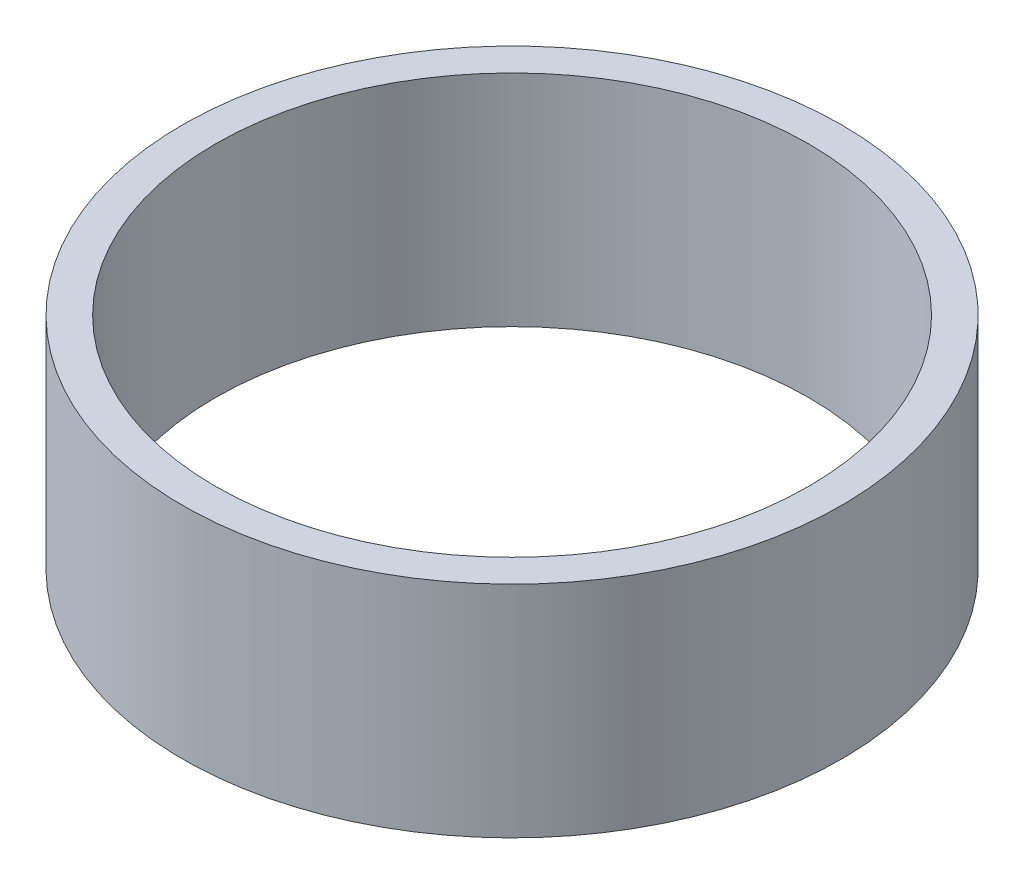
ISO-10303-21;
HEADER;
FILE_DESCRIPTION(('STEP AP214'),'2;1');
FILE_NAME('part.step','',(''),(''),'','','');
FILE_SCHEMA(('AUTOMOTIVE_DESIGN { 1 0 10303 214 1 1 1 1 }'));
ENDSEC;
DATA;
#1=APPLICATION_CONTEXT('core data for automotive mechanical design processes');
#2=APPLICATION_PROTOCOL_DEFINITION('international standard','automotive_design',2000,#1);
#3=PRODUCT_CONTEXT('',#1,'mechanical');
#4=PRODUCT('Part','Part','',(#3));
#5=PRODUCT_RELATED_PRODUCT_CATEGORY('part','',(#4));
#6=PRODUCT_DEFINITION_FORMATION('','',#4);
#7=PRODUCT_DEFINITION_CONTEXT('part definition',#1,'design');
#8=PRODUCT_DEFINITION('design','',#6,#7);
#9=PRODUCT_DEFINITION_SHAPE('','',#8);
#10=(LENGTH_UNIT() NAMED_UNIT(*) SI_UNIT(.MILLI.,.METRE.));
#11=(NAMED_UNIT(*) PLANE_ANGLE_UNIT() SI_UNIT($,.RADIAN.));
#12=(NAMED_UNIT(*) SI_UNIT($,.STERADIAN.) SOLID_ANGLE_UNIT());
#13=UNCERTAINTY_MEASURE_WITH_UNIT(LENGTH_MEASURE(1.E-05),#10,'distance_accuracy_value','');
#14=(GEOMETRIC_REPRESENTATION_CONTEXT(3) GLOBAL_UNCERTAINTY_ASSIGNED_CONTEXT((#13)) GLOBAL_UNIT_ASSIGNED_CONTEXT((#10,
#11,#12)) REPRESENTATION_CONTEXT('',''));
#15=CARTESIAN_POINT('',(0.,0.,0.));
#16=DIRECTION('',(0.,0.,1.));
#17=DIRECTION('',(1.,0.,0.));
#18=AXIS2_PLACEMENT_3D('',#15,#16,#17);
#19=CARTESIAN_POINT('',(0.,25.4,0.));
#20=DIRECTION('',(0.,-1.,0.));
#21=DIRECTION('',(0.,0.,-1.));
#22=AXIS2_PLACEMENT_3D('',#19,#20,#21);
#23=CYLINDRICAL_SURFACE('',#22,68.58);
#24=CARTESIAN_POINT('',(0.,-25.4,0.));
#25=DIRECTION('',(0.,-1.,0.));
#26=DIRECTION('',(0.,0.,-1.));
#27=AXIS2_PLACEMENT_3D('',#24,#25,#26);
#28=CIRCLE('',#27,68.58);
#29=CARTESIAN_POINT('',(0.,-25.4,-68.58));
#30=VERTEX_POINT('',#29);
#31=EDGE_CURVE('E27',#30,#30,#28,.T.);
#32=ORIENTED_EDGE('',*,*,#31,.T.);
#33=EDGE_LOOP('',(#32));
#34=FACE_BOUND('',#33,.T.);
#35=CARTESIAN_POINT('',(0.,25.4,0.));
#36=DIRECTION('',(0.,-1.,0.));
#37=DIRECTION('',(0.,0.,-1.));
#38=AXIS2_PLACEMENT_3D('',#35,#36,#37);
#39=CIRCLE('',#38,68.58);
#40=CARTESIAN_POINT('',(0.,25.4,-68.58));
#41=VERTEX_POINT('',#40);
#42=EDGE_CURVE('E18',#41,#41,#39,.T.);
#43=ORIENTED_EDGE('',*,*,#42,.F.);
#44=EDGE_LOOP('',(#43));
#45=FACE_BOUND('',#44,.T.);
#46=ADVANCED_FACE('F15',(#34,#45),#23,.F.);
#47=CARTESIAN_POINT('',(0.,25.4,0.));
#48=DIRECTION('',(0.,1.,0.));
#49=DIRECTION('',(0.,0.,1.));
#50=AXIS2_PLACEMENT_3D('',#47,#48,#49);
#51=PLANE('',#50);
#52=ORIENTED_EDGE('',*,*,#42,.T.);
#53=EDGE_LOOP('',(#52));
#54=FACE_BOUND('',#53,.T.);
#55=CARTESIAN_POINT('',(0.,25.4,0.));
#56=DIRECTION('',(0.,-1.,0.));
#57=DIRECTION('',(0.,0.,-1.));
#58=AXIS2_PLACEMENT_3D('',#55,#56,#57);
#59=CIRCLE('',#58,76.2);
#60=CARTESIAN_POINT('',(0.,25.4,-76.2));
#61=VERTEX_POINT('',#60);
#62=EDGE_CURVE('E22',#61,#61,#59,.T.);
#63=ORIENTED_EDGE('',*,*,#62,.F.);
#64=EDGE_LOOP('',(#63));
#65=FACE_BOUND('',#64,.T.);
#66=ADVANCED_FACE('F35',(#54,#65),#51,.T.);
#67=CARTESIAN_POINT('',(0.,-25.4,0.));
#68=DIRECTION('',(0.,1.,0.));
#69=DIRECTION('',(0.,0.,1.));
#70=AXIS2_PLACEMENT_3D('',#67,#68,#69);
#71=PLANE('',#70);
#72=ORIENTED_EDGE('',*,*,#31,.F.);
#73=EDGE_LOOP('',(#72));
#74=FACE_BOUND('',#73,.T.);
#75=CARTESIAN_POINT('',(0.,-25.4,0.));
#76=DIRECTION('',(0.,-1.,0.));
#77=DIRECTION('',(0.,0.,-1.));
#78=AXIS2_PLACEMENT_3D('',#75,#76,#77);
#79=CIRCLE('',#78,76.2);
#80=CARTESIAN_POINT('',(0.,-25.4,-76.2));
#81=VERTEX_POINT('',#80);
#82=EDGE_CURVE('E10',#81,#81,#79,.F.);
#83=ORIENTED_EDGE('',*,*,#82,.F.);
#84=EDGE_LOOP('',(#83));
#85=FACE_BOUND('',#84,.T.);
#86=ADVANCED_FACE('F43',(#74,#85),#71,.F.);
#87=CARTESIAN_POINT('',(0.,25.4,0.));
#88=DIRECTION('',(0.,-1.,0.));
#89=DIRECTION('',(0.,0.,-1.));
#90=AXIS2_PLACEMENT_3D('',#87,#88,#89);
#91=CYLINDRICAL_SURFACE('',#90,76.2);
#92=ORIENTED_EDGE('',*,*,#82,.T.);
#93=EDGE_LOOP('',(#92));
#94=FACE_BOUND('',#93,.T.);
#95=ORIENTED_EDGE('',*,*,#62,.T.);
#96=EDGE_LOOP('',(#95));
#97=FACE_BOUND('',#96,.T.);
#98=ADVANCED_FACE('F44',(#94,#97),#91,.T.);
#99=CLOSED_SHELL('',(#46,#66,#86,#98));
#100=MANIFOLD_SOLID_BREP('B1',#99);
#101=ADVANCED_BREP_SHAPE_REPRESENTATION('',(#18,#100),#14);
#102=SHAPE_DEFINITION_REPRESENTATION(#9,#101);
ENDSEC;
END-ISO-10303-21;
